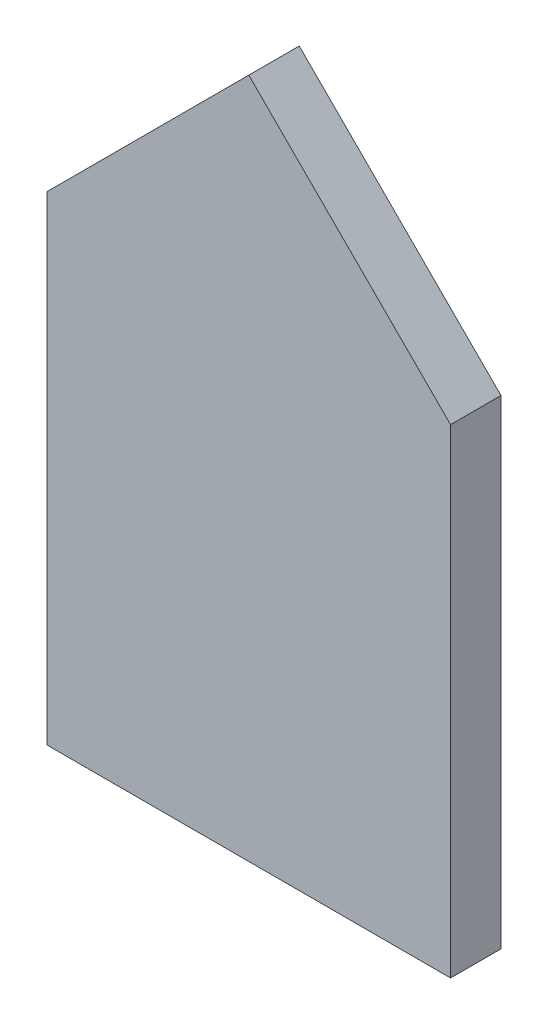
ISO-10303-21;
HEADER;
FILE_DESCRIPTION(('STEP AP214'),'2;1');
FILE_NAME('part.step','',(''),(''),'','','');
FILE_SCHEMA(('AUTOMOTIVE_DESIGN { 1 0 10303 214 1 1 1 1 }'));
ENDSEC;
DATA;
#1=APPLICATION_CONTEXT('core data for automotive mechanical design processes');
#2=APPLICATION_PROTOCOL_DEFINITION('international standard','automotive_design',2000,#1);
#3=PRODUCT_CONTEXT('',#1,'mechanical');
#4=PRODUCT('Part','Part','',(#3));
#5=PRODUCT_RELATED_PRODUCT_CATEGORY('part','',(#4));
#6=PRODUCT_DEFINITION_FORMATION('','',#4);
#7=PRODUCT_DEFINITION_CONTEXT('part definition',#1,'design');
#8=PRODUCT_DEFINITION('design','',#6,#7);
#9=PRODUCT_DEFINITION_SHAPE('','',#8);
#10=(LENGTH_UNIT() NAMED_UNIT(*) SI_UNIT(.MILLI.,.METRE.));
#11=(NAMED_UNIT(*) PLANE_ANGLE_UNIT() SI_UNIT($,.RADIAN.));
#12=(NAMED_UNIT(*) SI_UNIT($,.STERADIAN.) SOLID_ANGLE_UNIT());
#13=UNCERTAINTY_MEASURE_WITH_UNIT(LENGTH_MEASURE(1.E-05),#10,'distance_accuracy_value','');
#14=(GEOMETRIC_REPRESENTATION_CONTEXT(3) GLOBAL_UNCERTAINTY_ASSIGNED_CONTEXT((#13)) GLOBAL_UNIT_ASSIGNED_CONTEXT((#10,
#11,#12)) REPRESENTATION_CONTEXT('',''));
#15=CARTESIAN_POINT('',(0.,0.,0.));
#16=DIRECTION('',(0.,0.,1.));
#17=DIRECTION('',(1.,0.,0.));
#18=AXIS2_PLACEMENT_3D('',#15,#16,#17);
#19=CARTESIAN_POINT('',(-40.4523538285815,-55.2232447962161,10.));
#20=DIRECTION('',(-1.,0.,0.));
#21=DIRECTION('',(0.,0.,1.));
#22=AXIS2_PLACEMENT_3D('',#19,#20,#21);
#23=PLANE('',#22);
#24=DIRECTION('',(0.,1.,0.));
#25=VECTOR('',#24,1.);
#26=CARTESIAN_POINT('',(-40.4523538285815,-55.2232447962161,0.));
#27=LINE('',#26,#25);
#28=CARTESIAN_POINT('',(-40.4523538285815,-55.2232447962161,0.));
#29=VERTEX_POINT('',#28);
#30=CARTESIAN_POINT('',(-40.4523538285815,39.7767552037833,0.));
#31=VERTEX_POINT('',#30);
#32=EDGE_CURVE('E110',#29,#31,#27,.T.);
#33=ORIENTED_EDGE('',*,*,#32,.F.);
#34=DIRECTION('',(0.,0.,-1.));
#35=VECTOR('',#34,1.);
#36=CARTESIAN_POINT('',(-40.4523538285815,-55.2232447962161,10.));
#37=LINE('',#36,#35);
#38=CARTESIAN_POINT('',(-40.4523538285815,-55.2232447962161,10.));
#39=VERTEX_POINT('',#38);
#40=EDGE_CURVE('E11',#39,#29,#37,.T.);
#41=ORIENTED_EDGE('',*,*,#40,.F.);
#42=DIRECTION('',(0.,1.,0.));
#43=VECTOR('',#42,1.);
#44=CARTESIAN_POINT('',(-40.4523538285815,-55.2232447962161,10.));
#45=LINE('',#44,#43);
#46=CARTESIAN_POINT('',(-40.4523538285815,39.7767552037833,10.));
#47=VERTEX_POINT('',#46);
#48=EDGE_CURVE('E105',#39,#47,#45,.T.);
#49=ORIENTED_EDGE('',*,*,#48,.T.);
#50=DIRECTION('',(0.,0.,-1.));
#51=VECTOR('',#50,1.);
#52=CARTESIAN_POINT('',(-40.4523538285815,39.7767552037833,10.));
#53=LINE('',#52,#51);
#54=EDGE_CURVE('E35',#47,#31,#53,.T.);
#55=ORIENTED_EDGE('',*,*,#54,.T.);
#56=EDGE_LOOP('',(#33,#41,#49,#55));
#57=FACE_BOUND('',#56,.T.);
#58=ADVANCED_FACE('F32',(#57),#23,.T.);
#59=CARTESIAN_POINT('',(-40.4523538285815,-55.2232447962161,10.));
#60=DIRECTION('',(0.,1.,0.));
#61=DIRECTION('',(0.,0.,1.));
#62=AXIS2_PLACEMENT_3D('',#59,#60,#61);
#63=PLANE('',#62);
#64=DIRECTION('',(1.,0.,0.));
#65=VECTOR('',#64,1.);
#66=CARTESIAN_POINT('',(-40.4523538285815,-55.2232447962161,0.));
#67=LINE('',#66,#65);
#68=CARTESIAN_POINT('',(39.5476461714185,-55.2232447962161,0.));
#69=VERTEX_POINT('',#68);
#70=EDGE_CURVE('E119',#29,#69,#67,.T.);
#71=ORIENTED_EDGE('',*,*,#70,.T.);
#72=DIRECTION('',(0.,0.,-1.));
#73=VECTOR('',#72,1.);
#74=CARTESIAN_POINT('',(39.5476461714185,-55.2232447962161,10.));
#75=LINE('',#74,#73);
#76=CARTESIAN_POINT('',(39.5476461714185,-55.2232447962161,10.));
#77=VERTEX_POINT('',#76);
#78=EDGE_CURVE('E41',#77,#69,#75,.T.);
#79=ORIENTED_EDGE('',*,*,#78,.F.);
#80=DIRECTION('',(1.,0.,0.));
#81=VECTOR('',#80,1.);
#82=CARTESIAN_POINT('',(-40.4523538285815,-55.2232447962161,10.));
#83=LINE('',#82,#81);
#84=EDGE_CURVE('E100',#39,#77,#83,.T.);
#85=ORIENTED_EDGE('',*,*,#84,.F.);
#86=ORIENTED_EDGE('',*,*,#40,.T.);
#87=EDGE_LOOP('',(#71,#79,#85,#86));
#88=FACE_BOUND('',#87,.T.);
#89=ADVANCED_FACE('F124',(#88),#63,.F.);
#90=CARTESIAN_POINT('',(39.5476461714185,39.7767552037846,10.));
#91=DIRECTION('',(1.,0.,0.));
#92=DIRECTION('',(0.,0.,-1.));
#93=AXIS2_PLACEMENT_3D('',#90,#91,#92);
#94=PLANE('',#93);
#95=DIRECTION('',(0.,-1.,0.));
#96=VECTOR('',#95,1.);
#97=CARTESIAN_POINT('',(39.5476461714185,39.7767552037846,0.));
#98=LINE('',#97,#96);
#99=CARTESIAN_POINT('',(39.5476461714185,39.7767552037846,0.));
#100=VERTEX_POINT('',#99);
#101=EDGE_CURVE('E88',#100,#69,#98,.T.);
#102=ORIENTED_EDGE('',*,*,#101,.F.);
#103=DIRECTION('',(0.,0.,-1.));
#104=VECTOR('',#103,1.);
#105=CARTESIAN_POINT('',(39.5476461714185,39.7767552037846,10.));
#106=LINE('',#105,#104);
#107=CARTESIAN_POINT('',(39.5476461714185,39.7767552037846,10.));
#108=VERTEX_POINT('',#107);
#109=EDGE_CURVE('E83',#108,#100,#106,.T.);
#110=ORIENTED_EDGE('',*,*,#109,.F.);
#111=DIRECTION('',(0.,-1.,0.));
#112=VECTOR('',#111,1.);
#113=CARTESIAN_POINT('',(39.5476461714185,39.7767552037846,10.));
#114=LINE('',#113,#112);
#115=EDGE_CURVE('E86',#108,#77,#114,.T.);
#116=ORIENTED_EDGE('',*,*,#115,.T.);
#117=ORIENTED_EDGE('',*,*,#78,.T.);
#118=EDGE_LOOP('',(#102,#110,#116,#117));
#119=FACE_BOUND('',#118,.T.);
#120=ADVANCED_FACE('F85',(#119),#94,.T.);
#121=CARTESIAN_POINT('',(-0.452353828581463,79.7767552037839,10.));
#122=DIRECTION('',(0.707106781186541,0.707106781186554,0.));
#123=DIRECTION('',(-0.707106781186554,0.707106781186541,0.));
#124=AXIS2_PLACEMENT_3D('',#121,#122,#123);
#125=PLANE('',#124);
#126=DIRECTION('',(0.707106781186554,-0.707106781186541,0.));
#127=VECTOR('',#126,1.);
#128=CARTESIAN_POINT('',(-0.452353828581463,79.7767552037839,0.));
#129=LINE('',#128,#127);
#130=CARTESIAN_POINT('',(-0.452353828581463,79.7767552037839,0.));
#131=VERTEX_POINT('',#130);
#132=EDGE_CURVE('E116',#131,#100,#129,.T.);
#133=ORIENTED_EDGE('',*,*,#132,.F.);
#134=DIRECTION('',(0.,0.,-1.));
#135=VECTOR('',#134,1.);
#136=CARTESIAN_POINT('',(-0.452353828581463,79.7767552037839,10.));
#137=LINE('',#136,#135);
#138=CARTESIAN_POINT('',(-0.452353828581463,79.7767552037839,10.));
#139=VERTEX_POINT('',#138);
#140=EDGE_CURVE('E93',#139,#131,#137,.T.);
#141=ORIENTED_EDGE('',*,*,#140,.F.);
#142=DIRECTION('',(0.707106781186554,-0.707106781186541,0.));
#143=VECTOR('',#142,1.);
#144=CARTESIAN_POINT('',(-0.452353828581463,79.7767552037839,10.));
#145=LINE('',#144,#143);
#146=EDGE_CURVE('E99',#139,#108,#145,.T.);
#147=ORIENTED_EDGE('',*,*,#146,.T.);
#148=ORIENTED_EDGE('',*,*,#109,.T.);
#149=EDGE_LOOP('',(#133,#141,#147,#148));
#150=FACE_BOUND('',#149,.T.);
#151=ADVANCED_FACE('F102',(#150),#125,.T.);
#152=CARTESIAN_POINT('',(-40.4523538285815,39.7767552037833,10.));
#153=DIRECTION('',(-0.707106781186553,0.707106781186542,0.));
#154=DIRECTION('',(-0.707106781186542,-0.707106781186553,0.));
#155=AXIS2_PLACEMENT_3D('',#152,#153,#154);
#156=PLANE('',#155);
#157=DIRECTION('',(0.707106781186542,0.707106781186553,0.));
#158=VECTOR('',#157,1.);
#159=CARTESIAN_POINT('',(-40.4523538285815,39.7767552037833,0.));
#160=LINE('',#159,#158);
#161=EDGE_CURVE('E113',#31,#131,#160,.T.);
#162=ORIENTED_EDGE('',*,*,#161,.F.);
#163=ORIENTED_EDGE('',*,*,#54,.F.);
#164=DIRECTION('',(0.707106781186542,0.707106781186553,0.));
#165=VECTOR('',#164,1.);
#166=CARTESIAN_POINT('',(-40.4523538285815,39.7767552037833,10.));
#167=LINE('',#166,#165);
#168=EDGE_CURVE('E103',#47,#139,#167,.T.);
#169=ORIENTED_EDGE('',*,*,#168,.T.);
#170=ORIENTED_EDGE('',*,*,#140,.T.);
#171=EDGE_LOOP('',(#162,#163,#169,#170));
#172=FACE_BOUND('',#171,.T.);
#173=ADVANCED_FACE('F121',(#172),#156,.T.);
#174=CARTESIAN_POINT('',(0.,0.,10.));
#175=DIRECTION('',(0.,0.,-1.));
#176=DIRECTION('',(-1.,0.,0.));
#177=AXIS2_PLACEMENT_3D('',#174,#175,#176);
#178=PLANE('',#177);
#179=ORIENTED_EDGE('',*,*,#48,.F.);
#180=ORIENTED_EDGE('',*,*,#84,.T.);
#181=ORIENTED_EDGE('',*,*,#115,.F.);
#182=ORIENTED_EDGE('',*,*,#146,.F.);
#183=ORIENTED_EDGE('',*,*,#168,.F.);
#184=EDGE_LOOP('',(#179,#180,#181,#182,#183));
#185=FACE_BOUND('',#184,.T.);
#186=ADVANCED_FACE('F98',(#185),#178,.F.);
#187=CARTESIAN_POINT('',(0.,0.,0.));
#188=DIRECTION('',(0.,0.,-1.));
#189=DIRECTION('',(-1.,0.,0.));
#190=AXIS2_PLACEMENT_3D('',#187,#188,#189);
#191=PLANE('',#190);
#192=ORIENTED_EDGE('',*,*,#32,.T.);
#193=ORIENTED_EDGE('',*,*,#161,.T.);
#194=ORIENTED_EDGE('',*,*,#132,.T.);
#195=ORIENTED_EDGE('',*,*,#101,.T.);
#196=ORIENTED_EDGE('',*,*,#70,.F.);
#197=EDGE_LOOP('',(#192,#193,#194,#195,#196));
#198=FACE_BOUND('',#197,.T.);
#199=ADVANCED_FACE('F123',(#198),#191,.T.);
#200=CLOSED_SHELL('',(#58,#89,#120,#151,#173,#186,#199));
#201=MANIFOLD_SOLID_BREP('B2',#200);
#202=ADVANCED_BREP_SHAPE_REPRESENTATION('',(#18,#201),#14);
#203=SHAPE_DEFINITION_REPRESENTATION(#9,#202);
ENDSEC;
END-ISO-10303-21;
